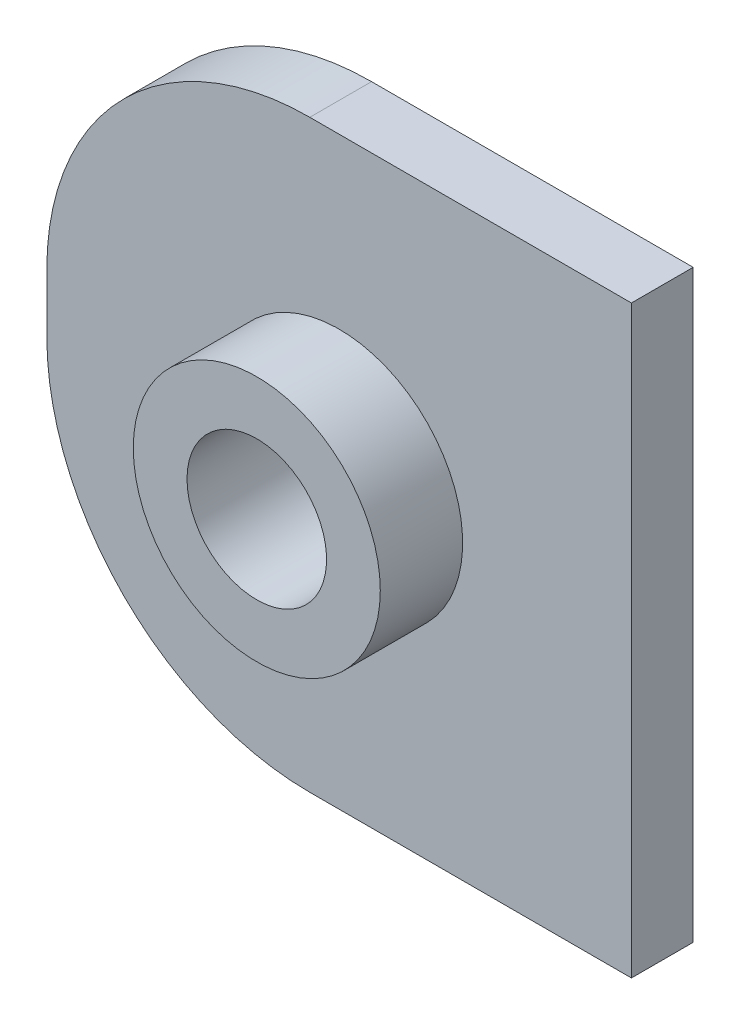
ISO-10303-21;
HEADER;
FILE_DESCRIPTION(('STEP AP214'),'2;1');
FILE_NAME('part.step','',(''),(''),'','','');
FILE_SCHEMA(('AUTOMOTIVE_DESIGN { 1 0 10303 214 1 1 1 1 }'));
ENDSEC;
DATA;
#1=APPLICATION_CONTEXT('core data for automotive mechanical design processes');
#2=APPLICATION_PROTOCOL_DEFINITION('international standard','automotive_design',2000,#1);
#3=PRODUCT_CONTEXT('',#1,'mechanical');
#4=PRODUCT('Part','Part','',(#3));
#5=PRODUCT_RELATED_PRODUCT_CATEGORY('part','',(#4));
#6=PRODUCT_DEFINITION_FORMATION('','',#4);
#7=PRODUCT_DEFINITION_CONTEXT('part definition',#1,'design');
#8=PRODUCT_DEFINITION('design','',#6,#7);
#9=PRODUCT_DEFINITION_SHAPE('','',#8);
#10=(LENGTH_UNIT() NAMED_UNIT(*) SI_UNIT(.MILLI.,.METRE.));
#11=(NAMED_UNIT(*) PLANE_ANGLE_UNIT() SI_UNIT($,.RADIAN.));
#12=(NAMED_UNIT(*) SI_UNIT($,.STERADIAN.) SOLID_ANGLE_UNIT());
#13=UNCERTAINTY_MEASURE_WITH_UNIT(LENGTH_MEASURE(1.E-05),#10,'distance_accuracy_value','');
#14=(GEOMETRIC_REPRESENTATION_CONTEXT(3) GLOBAL_UNCERTAINTY_ASSIGNED_CONTEXT((#13)) GLOBAL_UNIT_ASSIGNED_CONTEXT((#10,
#11,#12)) REPRESENTATION_CONTEXT('',''));
#15=CARTESIAN_POINT('',(0.,0.,0.));
#16=DIRECTION('',(0.,0.,1.));
#17=DIRECTION('',(1.,0.,0.));
#18=AXIS2_PLACEMENT_3D('',#15,#16,#17);
#19=CARTESIAN_POINT('',(-9.017,-9.017,1.905));
#20=DIRECTION('',(1.,0.,0.));
#21=DIRECTION('',(0.,0.,-1.));
#22=AXIS2_PLACEMENT_3D('',#19,#20,#21);
#23=PLANE('',#22);
#24=DIRECTION('',(0.,0.,-1.));
#25=VECTOR('',#24,1.);
#26=CARTESIAN_POINT('',(-9.017,0.904485111143076,4.445));
#27=LINE('',#26,#25);
#28=CARTESIAN_POINT('',(-9.017,0.904485111143076,0.));
#29=VERTEX_POINT('',#28);
#30=CARTESIAN_POINT('',(-9.017,0.904485111143076,1.905));
#31=VERTEX_POINT('',#30);
#32=EDGE_CURVE('E11',#29,#31,#27,.F.);
#33=ORIENTED_EDGE('',*,*,#32,.F.);
#34=DIRECTION('',(0.,-1.,0.));
#35=VECTOR('',#34,1.);
#36=CARTESIAN_POINT('',(-9.017,-9.017,0.));
#37=LINE('',#36,#35);
#38=CARTESIAN_POINT('',(-9.017,-0.904485111143075,0.));
#39=VERTEX_POINT('',#38);
#40=EDGE_CURVE('E107',#29,#39,#37,.T.);
#41=ORIENTED_EDGE('',*,*,#40,.T.);
#42=DIRECTION('',(0.,0.,-1.));
#43=VECTOR('',#42,1.);
#44=CARTESIAN_POINT('',(-9.017,-0.904485111143075,4.445));
#45=LINE('',#44,#43);
#46=CARTESIAN_POINT('',(-9.017,-0.904485111143075,1.905));
#47=VERTEX_POINT('',#46);
#48=EDGE_CURVE('E109',#47,#39,#45,.T.);
#49=ORIENTED_EDGE('',*,*,#48,.F.);
#50=DIRECTION('',(0.,-1.,0.));
#51=VECTOR('',#50,1.);
#52=CARTESIAN_POINT('',(-9.017,-9.017,1.905));
#53=LINE('',#52,#51);
#54=EDGE_CURVE('E153',#31,#47,#53,.T.);
#55=ORIENTED_EDGE('',*,*,#54,.F.);
#56=EDGE_LOOP('',(#33,#41,#49,#55));
#57=FACE_BOUND('',#56,.T.);
#58=ADVANCED_FACE('F38',(#57),#23,.F.);
#59=CARTESIAN_POINT('',(-9.017,-9.017,1.905));
#60=DIRECTION('',(0.,1.,0.));
#61=DIRECTION('',(0.,0.,1.));
#62=AXIS2_PLACEMENT_3D('',#59,#60,#61);
#63=PLANE('',#62);
#64=DIRECTION('',(0.,0.,-1.));
#65=VECTOR('',#64,1.);
#66=CARTESIAN_POINT('',(-0.904485111143078,-9.017,4.445));
#67=LINE('',#66,#65);
#68=CARTESIAN_POINT('',(-0.904485111143079,-9.017,0.));
#69=VERTEX_POINT('',#68);
#70=CARTESIAN_POINT('',(-0.90448511114308,-9.017,1.905));
#71=VERTEX_POINT('',#70);
#72=EDGE_CURVE('E47',#69,#71,#67,.F.);
#73=ORIENTED_EDGE('',*,*,#72,.F.);
#74=DIRECTION('',(1.,0.,0.));
#75=VECTOR('',#74,1.);
#76=CARTESIAN_POINT('',(-9.017,-9.017,0.));
#77=LINE('',#76,#75);
#78=CARTESIAN_POINT('',(9.017,-9.017,0.));
#79=VERTEX_POINT('',#78);
#80=EDGE_CURVE('E120',#69,#79,#77,.T.);
#81=ORIENTED_EDGE('',*,*,#80,.T.);
#82=DIRECTION('',(0.,0.,-1.));
#83=VECTOR('',#82,1.);
#84=CARTESIAN_POINT('',(9.017,-9.017,1.905));
#85=LINE('',#84,#83);
#86=CARTESIAN_POINT('',(9.017,-9.017,1.905));
#87=VERTEX_POINT('',#86);
#88=EDGE_CURVE('E129',#87,#79,#85,.T.);
#89=ORIENTED_EDGE('',*,*,#88,.F.);
#90=DIRECTION('',(1.,0.,0.));
#91=VECTOR('',#90,1.);
#92=CARTESIAN_POINT('',(-9.017,-9.017,1.905));
#93=LINE('',#92,#91);
#94=EDGE_CURVE('E133',#71,#87,#93,.T.);
#95=ORIENTED_EDGE('',*,*,#94,.F.);
#96=EDGE_LOOP('',(#73,#81,#89,#95));
#97=FACE_BOUND('',#96,.T.);
#98=ADVANCED_FACE('F156',(#97),#63,.F.);
#99=CARTESIAN_POINT('',(0.,0.,1.905));
#100=DIRECTION('',(0.,0.,-1.));
#101=DIRECTION('',(-1.,0.,0.));
#102=AXIS2_PLACEMENT_3D('',#99,#100,#101);
#103=PLANE('',#102);
#104=DIRECTION('',(-1.,0.,0.));
#105=VECTOR('',#104,1.);
#106=CARTESIAN_POINT('',(-9.017,9.017,1.905));
#107=LINE('',#106,#105);
#108=CARTESIAN_POINT('',(9.017,9.017,1.905));
#109=VERTEX_POINT('',#108);
#110=CARTESIAN_POINT('',(-0.904485111143077,9.017,1.905));
#111=VERTEX_POINT('',#110);
#112=EDGE_CURVE('E160',#109,#111,#107,.T.);
#113=ORIENTED_EDGE('',*,*,#112,.T.);
#114=CARTESIAN_POINT('',(-0.904485111143077,0.904485111143076,1.905));
#115=DIRECTION('',(0.,0.,-1.));
#116=DIRECTION('',(-1.,0.,0.));
#117=AXIS2_PLACEMENT_3D('',#114,#115,#116);
#118=CIRCLE('',#117,8.11251488885692);
#119=EDGE_CURVE('E92',#111,#31,#118,.F.);
#120=ORIENTED_EDGE('',*,*,#119,.T.);
#121=ORIENTED_EDGE('',*,*,#54,.T.);
#122=CARTESIAN_POINT('',(-0.904485111143078,-0.904485111143075,1.905));
#123=DIRECTION('',(0.,0.,-1.));
#124=DIRECTION('',(-1.,0.,0.));
#125=AXIS2_PLACEMENT_3D('',#122,#123,#124);
#126=CIRCLE('',#125,8.11251488885692);
#127=EDGE_CURVE('E97',#47,#71,#126,.F.);
#128=ORIENTED_EDGE('',*,*,#127,.T.);
#129=ORIENTED_EDGE('',*,*,#94,.T.);
#130=DIRECTION('',(0.,1.,0.));
#131=VECTOR('',#130,1.);
#132=CARTESIAN_POINT('',(9.017,-9.017,1.905));
#133=LINE('',#132,#131);
#134=EDGE_CURVE('E128',#87,#109,#133,.T.);
#135=ORIENTED_EDGE('',*,*,#134,.T.);
#136=EDGE_LOOP('',(#113,#120,#121,#128,#129,#135));
#137=FACE_BOUND('',#136,.T.);
#138=CARTESIAN_POINT('',(0.,0.,1.905));
#139=DIRECTION('',(0.,0.,-1.));
#140=DIRECTION('',(-1.,0.,0.));
#141=AXIS2_PLACEMENT_3D('',#138,#139,#140);
#142=CIRCLE('',#141,3.81);
#143=CARTESIAN_POINT('',(-3.81,0.,1.905));
#144=VERTEX_POINT('',#143);
#145=EDGE_CURVE('E136',#144,#144,#142,.F.);
#146=ORIENTED_EDGE('',*,*,#145,.F.);
#147=EDGE_LOOP('',(#146));
#148=FACE_BOUND('',#147,.T.);
#149=ADVANCED_FACE('F148',(#137,#148),#103,.F.);
#150=CARTESIAN_POINT('',(0.,0.,0.));
#151=DIRECTION('',(0.,0.,-1.));
#152=DIRECTION('',(-1.,0.,0.));
#153=AXIS2_PLACEMENT_3D('',#150,#151,#152);
#154=PLANE('',#153);
#155=CARTESIAN_POINT('',(-0.904485111143077,0.904485111143076,0.));
#156=DIRECTION('',(0.,0.,1.));
#157=DIRECTION('',(1.,0.,0.));
#158=AXIS2_PLACEMENT_3D('',#155,#156,#157);
#159=CIRCLE('',#158,8.11251488885692);
#160=CARTESIAN_POINT('',(-0.904485111143077,9.017,0.));
#161=VERTEX_POINT('',#160);
#162=EDGE_CURVE('E53',#161,#29,#159,.T.);
#163=ORIENTED_EDGE('',*,*,#162,.F.);
#164=DIRECTION('',(-1.,0.,0.));
#165=VECTOR('',#164,1.);
#166=CARTESIAN_POINT('',(-9.017,9.017,0.));
#167=LINE('',#166,#165);
#168=CARTESIAN_POINT('',(9.017,9.017,0.));
#169=VERTEX_POINT('',#168);
#170=EDGE_CURVE('E104',#169,#161,#167,.T.);
#171=ORIENTED_EDGE('',*,*,#170,.F.);
#172=DIRECTION('',(0.,1.,0.));
#173=VECTOR('',#172,1.);
#174=CARTESIAN_POINT('',(9.017,-9.017,0.));
#175=LINE('',#174,#173);
#176=EDGE_CURVE('E116',#79,#169,#175,.T.);
#177=ORIENTED_EDGE('',*,*,#176,.F.);
#178=ORIENTED_EDGE('',*,*,#80,.F.);
#179=CARTESIAN_POINT('',(-0.904485111143078,-0.904485111143075,0.));
#180=DIRECTION('',(0.,0.,1.));
#181=DIRECTION('',(-1.,0.,0.));
#182=AXIS2_PLACEMENT_3D('',#179,#180,#181);
#183=CIRCLE('',#182,8.11251488885692);
#184=EDGE_CURVE('E61',#39,#69,#183,.T.);
#185=ORIENTED_EDGE('',*,*,#184,.F.);
#186=ORIENTED_EDGE('',*,*,#40,.F.);
#187=EDGE_LOOP('',(#163,#171,#177,#178,#185,#186));
#188=FACE_BOUND('',#187,.T.);
#189=CARTESIAN_POINT('',(0.,0.,0.));
#190=DIRECTION('',(0.,0.,1.));
#191=DIRECTION('',(1.,0.,0.));
#192=AXIS2_PLACEMENT_3D('',#189,#190,#191);
#193=CIRCLE('',#192,2.15265);
#194=CARTESIAN_POINT('',(-2.15265,0.,0.));
#195=VERTEX_POINT('',#194);
#196=EDGE_CURVE('E122',#195,#195,#193,.T.);
#197=ORIENTED_EDGE('',*,*,#196,.T.);
#198=EDGE_LOOP('',(#197));
#199=FACE_BOUND('',#198,.T.);
#200=ADVANCED_FACE('F101',(#188,#199),#154,.T.);
#201=CARTESIAN_POINT('',(9.017,-9.017,1.905));
#202=DIRECTION('',(-1.,0.,0.));
#203=DIRECTION('',(0.,0.,1.));
#204=AXIS2_PLACEMENT_3D('',#201,#202,#203);
#205=PLANE('',#204);
#206=ORIENTED_EDGE('',*,*,#176,.T.);
#207=DIRECTION('',(0.,0.,-1.));
#208=VECTOR('',#207,1.);
#209=CARTESIAN_POINT('',(9.017,9.017,1.905));
#210=LINE('',#209,#208);
#211=EDGE_CURVE('E113',#109,#169,#210,.T.);
#212=ORIENTED_EDGE('',*,*,#211,.F.);
#213=ORIENTED_EDGE('',*,*,#134,.F.);
#214=ORIENTED_EDGE('',*,*,#88,.T.);
#215=EDGE_LOOP('',(#206,#212,#213,#214));
#216=FACE_BOUND('',#215,.T.);
#217=ADVANCED_FACE('F40',(#216),#205,.F.);
#218=CARTESIAN_POINT('',(-9.017,9.017,1.905));
#219=DIRECTION('',(0.,-1.,0.));
#220=DIRECTION('',(0.,0.,-1.));
#221=AXIS2_PLACEMENT_3D('',#218,#219,#220);
#222=PLANE('',#221);
#223=ORIENTED_EDGE('',*,*,#170,.T.);
#224=DIRECTION('',(0.,0.,-1.));
#225=VECTOR('',#224,1.);
#226=CARTESIAN_POINT('',(-0.904485111143077,9.017,4.445));
#227=LINE('',#226,#225);
#228=EDGE_CURVE('E89',#111,#161,#227,.T.);
#229=ORIENTED_EDGE('',*,*,#228,.F.);
#230=ORIENTED_EDGE('',*,*,#112,.F.);
#231=ORIENTED_EDGE('',*,*,#211,.T.);
#232=EDGE_LOOP('',(#223,#229,#230,#231));
#233=FACE_BOUND('',#232,.T.);
#234=ADVANCED_FACE('F111',(#233),#222,.F.);
#235=CARTESIAN_POINT('',(0.,0.,1.905));
#236=DIRECTION('',(0.,0.,-1.));
#237=DIRECTION('',(-1.,0.,0.));
#238=AXIS2_PLACEMENT_3D('',#235,#236,#237);
#239=CYLINDRICAL_SURFACE('',#238,2.15265);
#240=CARTESIAN_POINT('',(0.,0.,4.445));
#241=DIRECTION('',(0.,0.,1.));
#242=DIRECTION('',(1.,0.,0.));
#243=AXIS2_PLACEMENT_3D('',#240,#241,#242);
#244=CIRCLE('',#243,2.15265);
#245=CARTESIAN_POINT('',(-2.15265,0.,4.445));
#246=VERTEX_POINT('',#245);
#247=EDGE_CURVE('E174',#246,#246,#244,.T.);
#248=CARTESIAN_POINT('',(-2.15265,0.,0.));
#249=CARTESIAN_POINT('',(-2.15265,0.,0.0463020833333333));
#250=CARTESIAN_POINT('',(-2.15265,0.,0.0926041666666667));
#251=CARTESIAN_POINT('',(-2.15265,0.,0.185208333333333));
#252=CARTESIAN_POINT('',(-2.15265,0.,0.231510416666667));
#253=CARTESIAN_POINT('',(-2.15265,0.,0.324114583333333));
#254=CARTESIAN_POINT('',(-2.15265,0.,0.370416666666667));
#255=CARTESIAN_POINT('',(-2.15265,0.,0.463020833333333));
#256=CARTESIAN_POINT('',(-2.15265,0.,0.509322916666667));
#257=CARTESIAN_POINT('',(-2.15265,0.,0.601927083333334));
#258=CARTESIAN_POINT('',(-2.15265,0.,0.648229166666667));
#259=CARTESIAN_POINT('',(-2.15265,0.,0.740833333333334));
#260=CARTESIAN_POINT('',(-2.15265,0.,0.787135416666667));
#261=CARTESIAN_POINT('',(-2.15265,0.,0.879739583333333));
#262=CARTESIAN_POINT('',(-2.15265,0.,0.926041666666667));
#263=CARTESIAN_POINT('',(-2.15265,0.,1.01864583333333));
#264=CARTESIAN_POINT('',(-2.15265,0.,1.06494791666667));
#265=CARTESIAN_POINT('',(-2.15265,0.,1.15755208333333));
#266=CARTESIAN_POINT('',(-2.15265,0.,1.20385416666667));
#267=CARTESIAN_POINT('',(-2.15265,0.,1.29645833333333));
#268=CARTESIAN_POINT('',(-2.15265,0.,1.34276041666667));
#269=CARTESIAN_POINT('',(-2.15265,0.,1.43536458333333));
#270=CARTESIAN_POINT('',(-2.15265,0.,1.48166666666667));
#271=CARTESIAN_POINT('',(-2.15265,0.,1.57427083333333));
#272=CARTESIAN_POINT('',(-2.15265,0.,1.62057291666667));
#273=CARTESIAN_POINT('',(-2.15265,0.,1.71317708333333));
#274=CARTESIAN_POINT('',(-2.15265,0.,1.75947916666667));
#275=CARTESIAN_POINT('',(-2.15265,0.,1.85208333333333));
#276=CARTESIAN_POINT('',(-2.15265,0.,1.89838541666667));
#277=CARTESIAN_POINT('',(-2.15265,0.,1.99098958333333));
#278=CARTESIAN_POINT('',(-2.15265,0.,2.03729166666667));
#279=CARTESIAN_POINT('',(-2.15265,0.,2.12989583333333));
#280=CARTESIAN_POINT('',(-2.15265,0.,2.17619791666667));
#281=CARTESIAN_POINT('',(-2.15265,0.,2.26880208333333));
#282=CARTESIAN_POINT('',(-2.15265,0.,2.31510416666667));
#283=CARTESIAN_POINT('',(-2.15265,0.,2.40770833333333));
#284=CARTESIAN_POINT('',(-2.15265,0.,2.45401041666667));
#285=CARTESIAN_POINT('',(-2.15265,0.,2.54661458333333));
#286=CARTESIAN_POINT('',(-2.15265,0.,2.59291666666667));
#287=CARTESIAN_POINT('',(-2.15265,0.,2.68552083333333));
#288=CARTESIAN_POINT('',(-2.15265,0.,2.73182291666667));
#289=CARTESIAN_POINT('',(-2.15265,0.,2.82442708333333));
#290=CARTESIAN_POINT('',(-2.15265,0.,2.87072916666667));
#291=CARTESIAN_POINT('',(-2.15265,0.,2.96333333333333));
#292=CARTESIAN_POINT('',(-2.15265,0.,3.00963541666667));
#293=CARTESIAN_POINT('',(-2.15265,0.,3.10223958333333));
#294=CARTESIAN_POINT('',(-2.15265,0.,3.14854166666667));
#295=CARTESIAN_POINT('',(-2.15265,0.,3.24114583333333));
#296=CARTESIAN_POINT('',(-2.15265,0.,3.28744791666667));
#297=CARTESIAN_POINT('',(-2.15265,0.,3.38005208333333));
#298=CARTESIAN_POINT('',(-2.15265,0.,3.42635416666667));
#299=CARTESIAN_POINT('',(-2.15265,0.,3.51895833333333));
#300=CARTESIAN_POINT('',(-2.15265,0.,3.56526041666667));
#301=CARTESIAN_POINT('',(-2.15265,0.,3.65786458333333));
#302=CARTESIAN_POINT('',(-2.15265,0.,3.70416666666667));
#303=CARTESIAN_POINT('',(-2.15265,0.,3.79677083333333));
#304=CARTESIAN_POINT('',(-2.15265,0.,3.84307291666667));
#305=CARTESIAN_POINT('',(-2.15265,0.,3.93567708333333));
#306=CARTESIAN_POINT('',(-2.15265,0.,3.98197916666667));
#307=CARTESIAN_POINT('',(-2.15265,0.,4.07458333333333));
#308=CARTESIAN_POINT('',(-2.15265,0.,4.12088541666667));
#309=CARTESIAN_POINT('',(-2.15265,0.,4.21348958333333));
#310=CARTESIAN_POINT('',(-2.15265,0.,4.25979166666667));
#311=CARTESIAN_POINT('',(-2.15265,0.,4.35239583333333));
#312=CARTESIAN_POINT('',(-2.15265,0.,4.39869791666667));
#313=CARTESIAN_POINT('',(-2.15265,0.,4.445));
#314=B_SPLINE_CURVE_WITH_KNOTS('',3,(#248,#249,#250,#251,#252,#253,#254,#255,#256,#257,#258,
#259,#260,#261,#262,#263,#264,#265,#266,#267,#268,#269,#270,#271,#272,#273,#274,#275,#276,#277,
#278,#279,#280,#281,#282,#283,#284,#285,#286,#287,#288,#289,#290,#291,#292,#293,#294,#295,#296,
#297,#298,#299,#300,#301,#302,#303,#304,#305,#306,#307,#308,#309,#310,#311,#312,#313),
.UNSPECIFIED.,.F.,.F.,(4,2,2,2,2,2,2,2,2,2,2,2,2,2,2,2,2,2,2,2,2,2,2,2,2,2,2,2,2,2,2,2,4),(0.,
0.13890625,0.2778125,0.41671875,0.555625,0.69453125,0.8334375,0.97234375,1.11125,1.25015625,
1.3890625,1.52796875,1.666875,1.80578125,1.9446875,2.08359375,2.2225,2.36140625,2.5003125,
2.63921875,2.778125,2.91703125,3.0559375,3.19484375,3.33375,3.47265625,3.6115625,3.75046875,
3.889375,4.02828125,4.1671875,4.30609375,4.445),.UNSPECIFIED.);
#315=EDGE_CURVE('BSEAM191',#195,#246,#314,.T.);
#316=ORIENTED_EDGE('',*,*,#196,.F.);
#317=ORIENTED_EDGE('',*,*,#247,.T.);
#318=ORIENTED_EDGE('',*,*,#315,.T.);
#319=ORIENTED_EDGE('',*,*,#315,.F.);
#320=EDGE_LOOP('',(#316,#318,#317,#319));
#321=FACE_BOUND('',#320,.T.);
#322=ADVANCED_FACE('F191',(#321),#239,.F.);
#323=CARTESIAN_POINT('',(0.,0.,4.445));
#324=DIRECTION('',(0.,0.,1.));
#325=DIRECTION('',(1.,0.,0.));
#326=AXIS2_PLACEMENT_3D('',#323,#324,#325);
#327=PLANE('',#326);
#328=CARTESIAN_POINT('',(0.,0.,4.445));
#329=DIRECTION('',(0.,0.,1.));
#330=DIRECTION('',(1.,0.,0.));
#331=AXIS2_PLACEMENT_3D('',#328,#329,#330);
#332=CIRCLE('',#331,3.81);
#333=CARTESIAN_POINT('',(3.81,0.,4.445));
#334=VERTEX_POINT('',#333);
#335=EDGE_CURVE('E170',#334,#334,#332,.T.);
#336=ORIENTED_EDGE('',*,*,#335,.T.);
#337=EDGE_LOOP('',(#336));
#338=FACE_BOUND('',#337,.T.);
#339=ORIENTED_EDGE('',*,*,#247,.F.);
#340=EDGE_LOOP('',(#339));
#341=FACE_BOUND('',#340,.T.);
#342=ADVANCED_FACE('F206',(#338,#341),#327,.T.);
#343=CARTESIAN_POINT('',(0.,0.,4.445));
#344=DIRECTION('',(0.,0.,-1.));
#345=DIRECTION('',(-1.,0.,0.));
#346=AXIS2_PLACEMENT_3D('',#343,#344,#345);
#347=CYLINDRICAL_SURFACE('',#346,3.81);
#348=ORIENTED_EDGE('',*,*,#335,.F.);
#349=EDGE_LOOP('',(#348));
#350=FACE_BOUND('',#349,.T.);
#351=ORIENTED_EDGE('',*,*,#145,.T.);
#352=EDGE_LOOP('',(#351));
#353=FACE_BOUND('',#352,.T.);
#354=ADVANCED_FACE('F208',(#350,#353),#347,.T.);
#355=CARTESIAN_POINT('',(-0.904485111143078,-0.904485111143075,4.445));
#356=DIRECTION('',(0.,0.,-1.));
#357=DIRECTION('',(-1.,0.,0.));
#358=AXIS2_PLACEMENT_3D('',#355,#356,#357);
#359=CYLINDRICAL_SURFACE('',#358,8.11251488885692);
#360=ORIENTED_EDGE('',*,*,#48,.T.);
#361=ORIENTED_EDGE('',*,*,#184,.T.);
#362=ORIENTED_EDGE('',*,*,#72,.T.);
#363=ORIENTED_EDGE('',*,*,#127,.F.);
#364=EDGE_LOOP('',(#360,#361,#362,#363));
#365=FACE_BOUND('',#364,.T.);
#366=ADVANCED_FACE('F141',(#365),#359,.T.);
#367=CARTESIAN_POINT('',(-0.904485111143077,0.904485111143076,4.445));
#368=DIRECTION('',(0.,0.,-1.));
#369=DIRECTION('',(-1.,0.,0.));
#370=AXIS2_PLACEMENT_3D('',#367,#368,#369);
#371=CYLINDRICAL_SURFACE('',#370,8.11251488885692);
#372=ORIENTED_EDGE('',*,*,#228,.T.);
#373=ORIENTED_EDGE('',*,*,#162,.T.);
#374=ORIENTED_EDGE('',*,*,#32,.T.);
#375=ORIENTED_EDGE('',*,*,#119,.F.);
#376=EDGE_LOOP('',(#372,#373,#374,#375));
#377=FACE_BOUND('',#376,.T.);
#378=ADVANCED_FACE('F90',(#377),#371,.T.);
#379=CLOSED_SHELL('',(#58,#98,#149,#200,#217,#234,#322,#342,#354,#366,#378));
#380=MANIFOLD_SOLID_BREP('B2',#379);
#381=ADVANCED_BREP_SHAPE_REPRESENTATION('',(#18,#380),#14);
#382=SHAPE_DEFINITION_REPRESENTATION(#9,#381);
ENDSEC;
END-ISO-10303-21;
